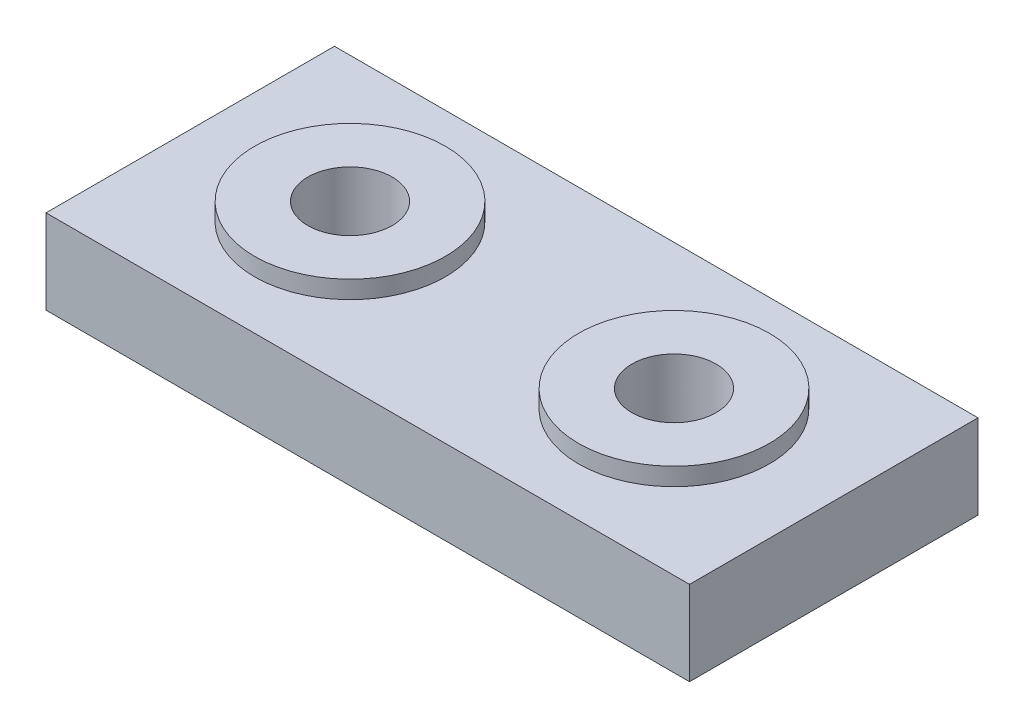
ISO-10303-21;
HEADER;
FILE_DESCRIPTION(('STEP AP214'),'2;1');
FILE_NAME('part.step','',(''),(''),'','','');
FILE_SCHEMA(('AUTOMOTIVE_DESIGN { 1 0 10303 214 1 1 1 1 }'));
ENDSEC;
DATA;
#1=APPLICATION_CONTEXT('core data for automotive mechanical design processes');
#2=APPLICATION_PROTOCOL_DEFINITION('international standard','automotive_design',2000,#1);
#3=PRODUCT_CONTEXT('',#1,'mechanical');
#4=PRODUCT('Part','Part','',(#3));
#5=PRODUCT_RELATED_PRODUCT_CATEGORY('part','',(#4));
#6=PRODUCT_DEFINITION_FORMATION('','',#4);
#7=PRODUCT_DEFINITION_CONTEXT('part definition',#1,'design');
#8=PRODUCT_DEFINITION('design','',#6,#7);
#9=PRODUCT_DEFINITION_SHAPE('','',#8);
#10=(LENGTH_UNIT() NAMED_UNIT(*) SI_UNIT(.MILLI.,.METRE.));
#11=(NAMED_UNIT(*) PLANE_ANGLE_UNIT() SI_UNIT($,.RADIAN.));
#12=(NAMED_UNIT(*) SI_UNIT($,.STERADIAN.) SOLID_ANGLE_UNIT());
#13=UNCERTAINTY_MEASURE_WITH_UNIT(LENGTH_MEASURE(1.E-05),#10,'distance_accuracy_value','');
#14=(GEOMETRIC_REPRESENTATION_CONTEXT(3) GLOBAL_UNCERTAINTY_ASSIGNED_CONTEXT((#13)) GLOBAL_UNIT_ASSIGNED_CONTEXT((#10,
#11,#12)) REPRESENTATION_CONTEXT('',''));
#15=CARTESIAN_POINT('',(0.,0.,0.));
#16=DIRECTION('',(0.,0.,1.));
#17=DIRECTION('',(1.,0.,0.));
#18=AXIS2_PLACEMENT_3D('',#15,#16,#17);
#19=CARTESIAN_POINT('',(-7.25,1.9,3.25));
#20=DIRECTION('',(1.,0.,0.));
#21=DIRECTION('',(0.,0.,-1.));
#22=AXIS2_PLACEMENT_3D('',#19,#20,#21);
#23=PLANE('',#22);
#24=DIRECTION('',(0.,0.,1.));
#25=VECTOR('',#24,1.);
#26=CARTESIAN_POINT('',(-7.25,0.,3.25));
#27=LINE('',#26,#25);
#28=CARTESIAN_POINT('',(-7.25,0.,-3.25));
#29=VERTEX_POINT('',#28);
#30=CARTESIAN_POINT('',(-7.25,0.,3.25));
#31=VERTEX_POINT('',#30);
#32=EDGE_CURVE('E145',#29,#31,#27,.T.);
#33=ORIENTED_EDGE('',*,*,#32,.T.);
#34=DIRECTION('',(0.,-1.,0.));
#35=VECTOR('',#34,1.);
#36=CARTESIAN_POINT('',(-7.25,1.9,3.25));
#37=LINE('',#36,#35);
#38=CARTESIAN_POINT('',(-7.25,1.9,3.25));
#39=VERTEX_POINT('',#38);
#40=EDGE_CURVE('E11',#39,#31,#37,.T.);
#41=ORIENTED_EDGE('',*,*,#40,.F.);
#42=DIRECTION('',(0.,0.,1.));
#43=VECTOR('',#42,1.);
#44=CARTESIAN_POINT('',(-7.25,1.9,3.25));
#45=LINE('',#44,#43);
#46=CARTESIAN_POINT('',(-7.25,1.9,-3.25));
#47=VERTEX_POINT('',#46);
#48=EDGE_CURVE('E179',#47,#39,#45,.T.);
#49=ORIENTED_EDGE('',*,*,#48,.F.);
#50=DIRECTION('',(0.,-1.,0.));
#51=VECTOR('',#50,1.);
#52=CARTESIAN_POINT('',(-7.25,1.9,-3.25));
#53=LINE('',#52,#51);
#54=EDGE_CURVE('E188',#47,#29,#53,.T.);
#55=ORIENTED_EDGE('',*,*,#54,.T.);
#56=EDGE_LOOP('',(#33,#41,#49,#55));
#57=FACE_BOUND('',#56,.T.);
#58=ADVANCED_FACE('F43',(#57),#23,.F.);
#59=CARTESIAN_POINT('',(7.25,1.9,3.25));
#60=DIRECTION('',(0.,0.,-1.));
#61=DIRECTION('',(-1.,0.,0.));
#62=AXIS2_PLACEMENT_3D('',#59,#60,#61);
#63=PLANE('',#62);
#64=DIRECTION('',(1.,0.,0.));
#65=VECTOR('',#64,1.);
#66=CARTESIAN_POINT('',(7.25,0.,3.25));
#67=LINE('',#66,#65);
#68=CARTESIAN_POINT('',(7.25,0.,3.25));
#69=VERTEX_POINT('',#68);
#70=EDGE_CURVE('E151',#31,#69,#67,.T.);
#71=ORIENTED_EDGE('',*,*,#70,.T.);
#72=DIRECTION('',(0.,-1.,0.));
#73=VECTOR('',#72,1.);
#74=CARTESIAN_POINT('',(7.25,1.9,3.25));
#75=LINE('',#74,#73);
#76=CARTESIAN_POINT('',(7.25,1.9,3.25));
#77=VERTEX_POINT('',#76);
#78=EDGE_CURVE('E52',#77,#69,#75,.T.);
#79=ORIENTED_EDGE('',*,*,#78,.F.);
#80=DIRECTION('',(1.,0.,0.));
#81=VECTOR('',#80,1.);
#82=CARTESIAN_POINT('',(7.25,1.9,3.25));
#83=LINE('',#82,#81);
#84=EDGE_CURVE('E97',#39,#77,#83,.T.);
#85=ORIENTED_EDGE('',*,*,#84,.F.);
#86=ORIENTED_EDGE('',*,*,#40,.T.);
#87=EDGE_LOOP('',(#71,#79,#85,#86));
#88=FACE_BOUND('',#87,.T.);
#89=ADVANCED_FACE('F234',(#88),#63,.F.);
#90=CARTESIAN_POINT('',(7.25,1.9,3.25));
#91=DIRECTION('',(-1.,0.,0.));
#92=DIRECTION('',(0.,0.,1.));
#93=AXIS2_PLACEMENT_3D('',#90,#91,#92);
#94=PLANE('',#93);
#95=DIRECTION('',(0.,0.,-1.));
#96=VECTOR('',#95,1.);
#97=CARTESIAN_POINT('',(7.25,0.,3.25));
#98=LINE('',#97,#96);
#99=CARTESIAN_POINT('',(7.25,0.,-3.25));
#100=VERTEX_POINT('',#99);
#101=EDGE_CURVE('E192',#69,#100,#98,.T.);
#102=ORIENTED_EDGE('',*,*,#101,.T.);
#103=DIRECTION('',(0.,-1.,0.));
#104=VECTOR('',#103,1.);
#105=CARTESIAN_POINT('',(7.25,1.9,-3.25));
#106=LINE('',#105,#104);
#107=CARTESIAN_POINT('',(7.25,1.9,-3.25));
#108=VERTEX_POINT('',#107);
#109=EDGE_CURVE('E199',#108,#100,#106,.T.);
#110=ORIENTED_EDGE('',*,*,#109,.F.);
#111=DIRECTION('',(0.,0.,-1.));
#112=VECTOR('',#111,1.);
#113=CARTESIAN_POINT('',(7.25,1.9,3.25));
#114=LINE('',#113,#112);
#115=EDGE_CURVE('E184',#77,#108,#114,.T.);
#116=ORIENTED_EDGE('',*,*,#115,.F.);
#117=ORIENTED_EDGE('',*,*,#78,.T.);
#118=EDGE_LOOP('',(#102,#110,#116,#117));
#119=FACE_BOUND('',#118,.T.);
#120=ADVANCED_FACE('F239',(#119),#94,.F.);
#121=CARTESIAN_POINT('',(7.25,1.9,-3.25));
#122=DIRECTION('',(0.,0.,1.));
#123=DIRECTION('',(1.,0.,0.));
#124=AXIS2_PLACEMENT_3D('',#121,#122,#123);
#125=PLANE('',#124);
#126=DIRECTION('',(-1.,0.,0.));
#127=VECTOR('',#126,1.);
#128=CARTESIAN_POINT('',(7.25,0.,-3.25));
#129=LINE('',#128,#127);
#130=EDGE_CURVE('E90',#100,#29,#129,.T.);
#131=ORIENTED_EDGE('',*,*,#130,.T.);
#132=ORIENTED_EDGE('',*,*,#54,.F.);
#133=DIRECTION('',(-1.,0.,0.));
#134=VECTOR('',#133,1.);
#135=CARTESIAN_POINT('',(7.25,1.9,-3.25));
#136=LINE('',#135,#134);
#137=EDGE_CURVE('E69',#108,#47,#136,.T.);
#138=ORIENTED_EDGE('',*,*,#137,.F.);
#139=ORIENTED_EDGE('',*,*,#109,.T.);
#140=EDGE_LOOP('',(#131,#132,#138,#139));
#141=FACE_BOUND('',#140,.T.);
#142=ADVANCED_FACE('F251',(#141),#125,.F.);
#143=CARTESIAN_POINT('',(0.,1.9,0.));
#144=DIRECTION('',(0.,1.,0.));
#145=DIRECTION('',(0.,0.,1.));
#146=AXIS2_PLACEMENT_3D('',#143,#144,#145);
#147=PLANE('',#146);
#148=CARTESIAN_POINT('',(3.65,1.9,0.));
#149=DIRECTION('',(0.,1.,0.));
#150=DIRECTION('',(0.,0.,-1.));
#151=AXIS2_PLACEMENT_3D('',#148,#149,#150);
#152=CIRCLE('',#151,2.15);
#153=CARTESIAN_POINT('',(3.65,1.9,-2.15));
#154=VERTEX_POINT('',#153);
#155=EDGE_CURVE('E213',#154,#154,#152,.T.);
#156=ORIENTED_EDGE('',*,*,#155,.F.);
#157=EDGE_LOOP('',(#156));
#158=FACE_BOUND('',#157,.T.);
#159=CARTESIAN_POINT('',(-3.65,1.9,0.));
#160=DIRECTION('',(0.,1.,0.));
#161=DIRECTION('',(0.,0.,1.));
#162=AXIS2_PLACEMENT_3D('',#159,#160,#161);
#163=CIRCLE('',#162,2.15);
#164=CARTESIAN_POINT('',(-3.65,1.9,2.15));
#165=VERTEX_POINT('',#164);
#166=EDGE_CURVE('E156',#165,#165,#163,.T.);
#167=ORIENTED_EDGE('',*,*,#166,.F.);
#168=EDGE_LOOP('',(#167));
#169=FACE_BOUND('',#168,.T.);
#170=ORIENTED_EDGE('',*,*,#48,.T.);
#171=ORIENTED_EDGE('',*,*,#84,.T.);
#172=ORIENTED_EDGE('',*,*,#115,.T.);
#173=ORIENTED_EDGE('',*,*,#137,.T.);
#174=EDGE_LOOP('',(#170,#171,#172,#173));
#175=FACE_BOUND('',#174,.T.);
#176=ADVANCED_FACE('F249',(#158,#169,#175),#147,.T.);
#177=CARTESIAN_POINT('',(0.,0.,0.));
#178=DIRECTION('',(0.,1.,0.));
#179=DIRECTION('',(0.,0.,1.));
#180=AXIS2_PLACEMENT_3D('',#177,#178,#179);
#181=PLANE('',#180);
#182=DIRECTION('',(-1.,0.,0.));
#183=VECTOR('',#182,1.);
#184=CARTESIAN_POINT('',(7.25,0.,-2.05));
#185=LINE('',#184,#183);
#186=CARTESIAN_POINT('',(6.05,0.,-2.05));
#187=VERTEX_POINT('',#186);
#188=CARTESIAN_POINT('',(-6.05,0.,-2.05));
#189=VERTEX_POINT('',#188);
#190=EDGE_CURVE('E139',#187,#189,#185,.T.);
#191=ORIENTED_EDGE('',*,*,#190,.T.);
#192=DIRECTION('',(0.,0.,1.));
#193=VECTOR('',#192,1.);
#194=CARTESIAN_POINT('',(-6.05,0.,3.25));
#195=LINE('',#194,#193);
#196=CARTESIAN_POINT('',(-6.05,0.,2.05));
#197=VERTEX_POINT('',#196);
#198=EDGE_CURVE('E168',#189,#197,#195,.T.);
#199=ORIENTED_EDGE('',*,*,#198,.T.);
#200=DIRECTION('',(1.,0.,0.));
#201=VECTOR('',#200,1.);
#202=CARTESIAN_POINT('',(7.25,0.,2.05));
#203=LINE('',#202,#201);
#204=CARTESIAN_POINT('',(6.05,0.,2.05));
#205=VERTEX_POINT('',#204);
#206=EDGE_CURVE('E143',#197,#205,#203,.T.);
#207=ORIENTED_EDGE('',*,*,#206,.T.);
#208=DIRECTION('',(0.,0.,-1.));
#209=VECTOR('',#208,1.);
#210=CARTESIAN_POINT('',(6.05,0.,3.25));
#211=LINE('',#210,#209);
#212=EDGE_CURVE('E60',#205,#187,#211,.T.);
#213=ORIENTED_EDGE('',*,*,#212,.T.);
#214=EDGE_LOOP('',(#191,#199,#207,#213));
#215=FACE_BOUND('',#214,.T.);
#216=ORIENTED_EDGE('',*,*,#32,.F.);
#217=ORIENTED_EDGE('',*,*,#130,.F.);
#218=ORIENTED_EDGE('',*,*,#101,.F.);
#219=ORIENTED_EDGE('',*,*,#70,.F.);
#220=EDGE_LOOP('',(#216,#217,#218,#219));
#221=FACE_BOUND('',#220,.T.);
#222=ADVANCED_FACE('F244',(#215,#221),#181,.F.);
#223=CARTESIAN_POINT('',(-6.05,1.9,3.25));
#224=DIRECTION('',(1.,0.,0.));
#225=DIRECTION('',(0.,0.,-1.));
#226=AXIS2_PLACEMENT_3D('',#223,#224,#225);
#227=PLANE('',#226);
#228=ORIENTED_EDGE('',*,*,#198,.F.);
#229=DIRECTION('',(0.,-1.,0.));
#230=VECTOR('',#229,1.);
#231=CARTESIAN_POINT('',(-6.05,1.9,-2.05));
#232=LINE('',#231,#230);
#233=CARTESIAN_POINT('',(-6.05,0.7,-2.05));
#234=VERTEX_POINT('',#233);
#235=EDGE_CURVE('E137',#234,#189,#232,.T.);
#236=ORIENTED_EDGE('',*,*,#235,.F.);
#237=DIRECTION('',(0.,0.,1.));
#238=VECTOR('',#237,1.);
#239=CARTESIAN_POINT('',(-6.05,0.7,3.25));
#240=LINE('',#239,#238);
#241=CARTESIAN_POINT('',(-6.05,0.7,2.05));
#242=VERTEX_POINT('',#241);
#243=EDGE_CURVE('E124',#234,#242,#240,.T.);
#244=ORIENTED_EDGE('',*,*,#243,.T.);
#245=DIRECTION('',(0.,-1.,0.));
#246=VECTOR('',#245,1.);
#247=CARTESIAN_POINT('',(-6.05,1.9,2.05));
#248=LINE('',#247,#246);
#249=EDGE_CURVE('E135',#242,#197,#248,.T.);
#250=ORIENTED_EDGE('',*,*,#249,.T.);
#251=EDGE_LOOP('',(#228,#236,#244,#250));
#252=FACE_BOUND('',#251,.T.);
#253=ADVANCED_FACE('F134',(#252),#227,.T.);
#254=CARTESIAN_POINT('',(7.25,1.9,2.05));
#255=DIRECTION('',(0.,0.,-1.));
#256=DIRECTION('',(-1.,0.,0.));
#257=AXIS2_PLACEMENT_3D('',#254,#255,#256);
#258=PLANE('',#257);
#259=ORIENTED_EDGE('',*,*,#206,.F.);
#260=ORIENTED_EDGE('',*,*,#249,.F.);
#261=DIRECTION('',(1.,0.,0.));
#262=VECTOR('',#261,1.);
#263=CARTESIAN_POINT('',(7.25,0.7,2.05));
#264=LINE('',#263,#262);
#265=CARTESIAN_POINT('',(6.05,0.7,2.05));
#266=VERTEX_POINT('',#265);
#267=EDGE_CURVE('E120',#242,#266,#264,.T.);
#268=ORIENTED_EDGE('',*,*,#267,.T.);
#269=DIRECTION('',(0.,-1.,0.));
#270=VECTOR('',#269,1.);
#271=CARTESIAN_POINT('',(6.05,1.9,2.05));
#272=LINE('',#271,#270);
#273=EDGE_CURVE('E146',#266,#205,#272,.T.);
#274=ORIENTED_EDGE('',*,*,#273,.T.);
#275=EDGE_LOOP('',(#259,#260,#268,#274));
#276=FACE_BOUND('',#275,.T.);
#277=ADVANCED_FACE('F141',(#276),#258,.T.);
#278=CARTESIAN_POINT('',(6.05,1.9,3.25));
#279=DIRECTION('',(-1.,0.,0.));
#280=DIRECTION('',(0.,0.,1.));
#281=AXIS2_PLACEMENT_3D('',#278,#279,#280);
#282=PLANE('',#281);
#283=ORIENTED_EDGE('',*,*,#212,.F.);
#284=ORIENTED_EDGE('',*,*,#273,.F.);
#285=DIRECTION('',(0.,0.,-1.));
#286=VECTOR('',#285,1.);
#287=CARTESIAN_POINT('',(6.05,0.7,3.25));
#288=LINE('',#287,#286);
#289=CARTESIAN_POINT('',(6.05,0.7,-2.05));
#290=VERTEX_POINT('',#289);
#291=EDGE_CURVE('E125',#266,#290,#288,.T.);
#292=ORIENTED_EDGE('',*,*,#291,.T.);
#293=DIRECTION('',(0.,-1.,0.));
#294=VECTOR('',#293,1.);
#295=CARTESIAN_POINT('',(6.05,1.9,-2.05));
#296=LINE('',#295,#294);
#297=EDGE_CURVE('E153',#290,#187,#296,.T.);
#298=ORIENTED_EDGE('',*,*,#297,.T.);
#299=EDGE_LOOP('',(#283,#284,#292,#298));
#300=FACE_BOUND('',#299,.T.);
#301=ADVANCED_FACE('F302',(#300),#282,.T.);
#302=CARTESIAN_POINT('',(7.25,1.9,-2.05));
#303=DIRECTION('',(0.,0.,1.));
#304=DIRECTION('',(1.,0.,0.));
#305=AXIS2_PLACEMENT_3D('',#302,#303,#304);
#306=PLANE('',#305);
#307=ORIENTED_EDGE('',*,*,#190,.F.);
#308=ORIENTED_EDGE('',*,*,#297,.F.);
#309=DIRECTION('',(-1.,0.,0.));
#310=VECTOR('',#309,1.);
#311=CARTESIAN_POINT('',(7.25,0.7,-2.05));
#312=LINE('',#311,#310);
#313=EDGE_CURVE('E160',#290,#234,#312,.T.);
#314=ORIENTED_EDGE('',*,*,#313,.T.);
#315=ORIENTED_EDGE('',*,*,#235,.T.);
#316=EDGE_LOOP('',(#307,#308,#314,#315));
#317=FACE_BOUND('',#316,.T.);
#318=ADVANCED_FACE('F312',(#317),#306,.T.);
#319=CARTESIAN_POINT('',(0.,0.7,0.));
#320=DIRECTION('',(0.,1.,0.));
#321=DIRECTION('',(0.,0.,1.));
#322=AXIS2_PLACEMENT_3D('',#319,#320,#321);
#323=PLANE('',#322);
#324=CARTESIAN_POINT('',(3.65,0.7,0.));
#325=DIRECTION('',(0.,1.,0.));
#326=DIRECTION('',(0.,0.,1.));
#327=AXIS2_PLACEMENT_3D('',#324,#325,#326);
#328=CIRCLE('',#327,0.95);
#329=CARTESIAN_POINT('',(3.65,0.7,0.95));
#330=VERTEX_POINT('',#329);
#331=EDGE_CURVE('E46',#330,#330,#328,.T.);
#332=ORIENTED_EDGE('',*,*,#331,.T.);
#333=EDGE_LOOP('',(#332));
#334=FACE_BOUND('',#333,.T.);
#335=CARTESIAN_POINT('',(-3.65,0.7,0.));
#336=DIRECTION('',(0.,1.,0.));
#337=DIRECTION('',(0.,0.,1.));
#338=AXIS2_PLACEMENT_3D('',#335,#336,#337);
#339=CIRCLE('',#338,0.95);
#340=CARTESIAN_POINT('',(-3.65,0.7,0.95));
#341=VERTEX_POINT('',#340);
#342=EDGE_CURVE('E204',#341,#341,#339,.T.);
#343=ORIENTED_EDGE('',*,*,#342,.T.);
#344=EDGE_LOOP('',(#343));
#345=FACE_BOUND('',#344,.T.);
#346=ORIENTED_EDGE('',*,*,#243,.F.);
#347=ORIENTED_EDGE('',*,*,#313,.F.);
#348=ORIENTED_EDGE('',*,*,#291,.F.);
#349=ORIENTED_EDGE('',*,*,#267,.F.);
#350=EDGE_LOOP('',(#346,#347,#348,#349));
#351=FACE_BOUND('',#350,.T.);
#352=ADVANCED_FACE('F122',(#334,#345,#351),#323,.F.);
#353=CARTESIAN_POINT('',(-3.65,2.3,0.));
#354=DIRECTION('',(0.,1.,0.));
#355=DIRECTION('',(0.,0.,1.));
#356=AXIS2_PLACEMENT_3D('',#353,#354,#355);
#357=PLANE('',#356);
#358=CARTESIAN_POINT('',(-3.65,2.3,0.));
#359=DIRECTION('',(0.,1.,0.));
#360=DIRECTION('',(0.,0.,1.));
#361=AXIS2_PLACEMENT_3D('',#358,#359,#360);
#362=CIRCLE('',#361,2.15);
#363=CARTESIAN_POINT('',(-3.65,2.3,2.15));
#364=VERTEX_POINT('',#363);
#365=EDGE_CURVE('E171',#364,#364,#362,.T.);
#366=ORIENTED_EDGE('',*,*,#365,.T.);
#367=EDGE_LOOP('',(#366));
#368=FACE_BOUND('',#367,.T.);
#369=CARTESIAN_POINT('',(-3.65,2.3,0.));
#370=DIRECTION('',(0.,1.,0.));
#371=DIRECTION('',(0.,0.,1.));
#372=AXIS2_PLACEMENT_3D('',#369,#370,#371);
#373=CIRCLE('',#372,0.95);
#374=CARTESIAN_POINT('',(-3.65,2.3,0.95));
#375=VERTEX_POINT('',#374);
#376=EDGE_CURVE('E430',#375,#375,#373,.T.);
#377=ORIENTED_EDGE('',*,*,#376,.F.);
#378=EDGE_LOOP('',(#377));
#379=FACE_BOUND('',#378,.T.);
#380=ADVANCED_FACE('F333',(#368,#379),#357,.T.);
#381=CARTESIAN_POINT('',(-3.65,2.3,0.));
#382=DIRECTION('',(0.,-1.,0.));
#383=DIRECTION('',(0.,0.,-1.));
#384=AXIS2_PLACEMENT_3D('',#381,#382,#383);
#385=CYLINDRICAL_SURFACE('',#384,2.15);
#386=ORIENTED_EDGE('',*,*,#365,.F.);
#387=EDGE_LOOP('',(#386));
#388=FACE_BOUND('',#387,.T.);
#389=ORIENTED_EDGE('',*,*,#166,.T.);
#390=EDGE_LOOP('',(#389));
#391=FACE_BOUND('',#390,.T.);
#392=ADVANCED_FACE('F338',(#388,#391),#385,.T.);
#393=CARTESIAN_POINT('',(-3.65,2.3,0.));
#394=DIRECTION('',(0.,-1.,0.));
#395=DIRECTION('',(0.,0.,-1.));
#396=AXIS2_PLACEMENT_3D('',#393,#394,#395);
#397=CYLINDRICAL_SURFACE('',#396,0.95);
#398=ORIENTED_EDGE('',*,*,#376,.T.);
#399=EDGE_LOOP('',(#398));
#400=FACE_BOUND('',#399,.T.);
#401=ORIENTED_EDGE('',*,*,#342,.F.);
#402=EDGE_LOOP('',(#401));
#403=FACE_BOUND('',#402,.T.);
#404=ADVANCED_FACE('F349',(#400,#403),#397,.F.);
#405=CARTESIAN_POINT('',(3.65,2.3,0.));
#406=DIRECTION('',(0.,-1.,0.));
#407=DIRECTION('',(0.,0.,-1.));
#408=AXIS2_PLACEMENT_3D('',#405,#406,#407);
#409=PLANE('',#408);
#410=CARTESIAN_POINT('',(3.65,2.3,0.));
#411=DIRECTION('',(0.,1.,0.));
#412=DIRECTION('',(0.,0.,-1.));
#413=AXIS2_PLACEMENT_3D('',#410,#411,#412);
#414=CIRCLE('',#413,2.15);
#415=CARTESIAN_POINT('',(3.65,2.3,-2.15));
#416=VERTEX_POINT('',#415);
#417=EDGE_CURVE('E207',#416,#416,#414,.T.);
#418=ORIENTED_EDGE('',*,*,#417,.T.);
#419=EDGE_LOOP('',(#418));
#420=FACE_BOUND('',#419,.T.);
#421=CARTESIAN_POINT('',(3.65,2.3,0.));
#422=DIRECTION('',(0.,1.,0.));
#423=DIRECTION('',(0.,0.,-1.));
#424=AXIS2_PLACEMENT_3D('',#421,#422,#423);
#425=CIRCLE('',#424,0.95);
#426=CARTESIAN_POINT('',(3.65,2.3,-0.95));
#427=VERTEX_POINT('',#426);
#428=EDGE_CURVE('E433',#427,#427,#425,.T.);
#429=ORIENTED_EDGE('',*,*,#428,.F.);
#430=EDGE_LOOP('',(#429));
#431=FACE_BOUND('',#430,.T.);
#432=ADVANCED_FACE('F227',(#420,#431),#409,.F.);
#433=CARTESIAN_POINT('',(3.65,2.3,0.));
#434=DIRECTION('',(0.,-1.,0.));
#435=DIRECTION('',(0.,0.,-1.));
#436=AXIS2_PLACEMENT_3D('',#433,#434,#435);
#437=CYLINDRICAL_SURFACE('',#436,2.15);
#438=ORIENTED_EDGE('',*,*,#417,.F.);
#439=EDGE_LOOP('',(#438));
#440=FACE_BOUND('',#439,.T.);
#441=ORIENTED_EDGE('',*,*,#155,.T.);
#442=EDGE_LOOP('',(#441));
#443=FACE_BOUND('',#442,.T.);
#444=ADVANCED_FACE('F221',(#440,#443),#437,.T.);
#445=CARTESIAN_POINT('',(3.65,2.3,0.));
#446=DIRECTION('',(0.,-1.,0.));
#447=DIRECTION('',(0.,0.,-1.));
#448=AXIS2_PLACEMENT_3D('',#445,#446,#447);
#449=CYLINDRICAL_SURFACE('',#448,0.95);
#450=ORIENTED_EDGE('',*,*,#428,.T.);
#451=EDGE_LOOP('',(#450));
#452=FACE_BOUND('',#451,.T.);
#453=ORIENTED_EDGE('',*,*,#331,.F.);
#454=EDGE_LOOP('',(#453));
#455=FACE_BOUND('',#454,.T.);
#456=ADVANCED_FACE('F219',(#452,#455),#449,.F.);
#457=CLOSED_SHELL('',(#58,#89,#120,#142,#176,#222,#253,#277,#301,#318,#352,#380,#392,#404,#432,
#444,#456));
#458=MANIFOLD_SOLID_BREP('B2',#457);
#459=ADVANCED_BREP_SHAPE_REPRESENTATION('',(#18,#458),#14);
#460=SHAPE_DEFINITION_REPRESENTATION(#9,#459);
ENDSEC;
END-ISO-10303-21;
